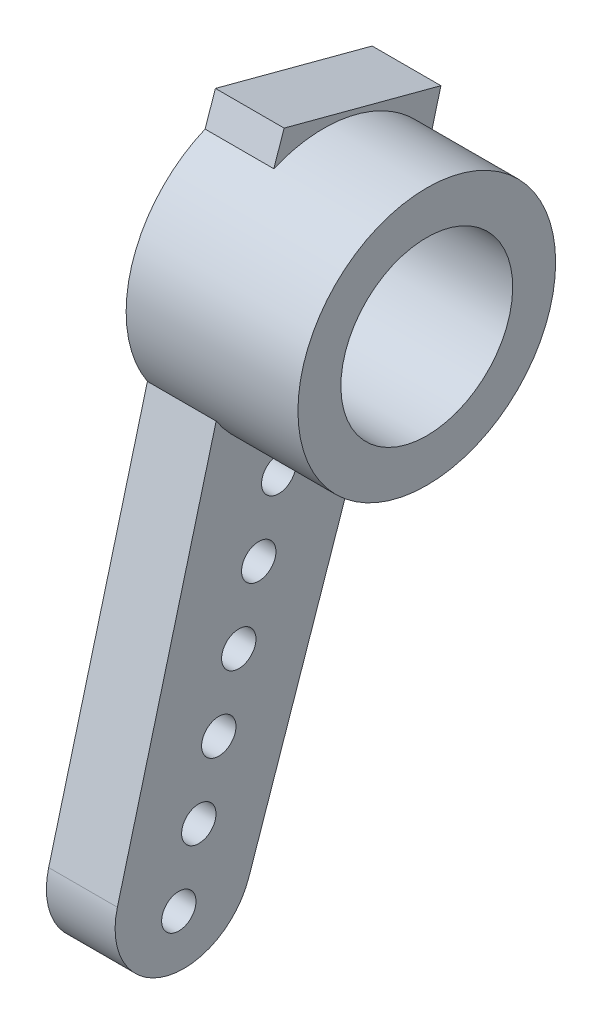
ISO-10303-21;
HEADER;
FILE_DESCRIPTION(('STEP AP214'),'2;1');
FILE_NAME('part.step','',(''),(''),'','','');
FILE_SCHEMA(('AUTOMOTIVE_DESIGN { 1 0 10303 214 1 1 1 1 }'));
ENDSEC;
DATA;
#1=APPLICATION_CONTEXT('core data for automotive mechanical design processes');
#2=APPLICATION_PROTOCOL_DEFINITION('international standard','automotive_design',2000,#1);
#3=PRODUCT_CONTEXT('',#1,'mechanical');
#4=PRODUCT('Part','Part','',(#3));
#5=PRODUCT_RELATED_PRODUCT_CATEGORY('part','',(#4));
#6=PRODUCT_DEFINITION_FORMATION('','',#4);
#7=PRODUCT_DEFINITION_CONTEXT('part definition',#1,'design');
#8=PRODUCT_DEFINITION('design','',#6,#7);
#9=PRODUCT_DEFINITION_SHAPE('','',#8);
#10=(LENGTH_UNIT() NAMED_UNIT(*) SI_UNIT(.MILLI.,.METRE.));
#11=(NAMED_UNIT(*) PLANE_ANGLE_UNIT() SI_UNIT($,.RADIAN.));
#12=(NAMED_UNIT(*) SI_UNIT($,.STERADIAN.) SOLID_ANGLE_UNIT());
#13=UNCERTAINTY_MEASURE_WITH_UNIT(LENGTH_MEASURE(1.E-05),#10,'distance_accuracy_value','');
#14=(GEOMETRIC_REPRESENTATION_CONTEXT(3) GLOBAL_UNCERTAINTY_ASSIGNED_CONTEXT((#13)) GLOBAL_UNIT_ASSIGNED_CONTEXT((#10,
#11,#12)) REPRESENTATION_CONTEXT('',''));
#15=CARTESIAN_POINT('',(0.,0.,0.));
#16=DIRECTION('',(0.,0.,1.));
#17=DIRECTION('',(1.,0.,0.));
#18=AXIS2_PLACEMENT_3D('',#15,#16,#17);
#19=CARTESIAN_POINT('',(-60.5321683868863,-3.89878457457896,-40.742461802461));
#20=DIRECTION('',(0.,-0.966465592869307,0.25679614054689));
#21=DIRECTION('',(0.,-0.25679614054689,-0.966465592869308));
#22=AXIS2_PLACEMENT_3D('',#19,#20,#21);
#23=PLANE('',#22);
#24=DIRECTION('',(0.,-0.25679614054689,-0.966465592869308));
#25=VECTOR('',#24,1.);
#26=CARTESIAN_POINT('',(-63.5421683868863,-3.25787408113389,-38.3303619215812));
#27=LINE('',#26,#25);
#28=CARTESIAN_POINT('',(-63.5421683868863,-2.68625102175923,-36.1790288921994));
#29=VERTEX_POINT('',#28);
#30=CARTESIAN_POINT('',(-63.5421683868863,-3.89878457457897,-40.7424618024611));
#31=VERTEX_POINT('',#30);
#32=EDGE_CURVE('E48',#29,#31,#27,.T.);
#33=ORIENTED_EDGE('',*,*,#32,.T.);
#34=DIRECTION('',(-1.,0.,0.));
#35=VECTOR('',#34,1.);
#36=CARTESIAN_POINT('',(-63.5421683868863,-3.89878457457898,-40.7424618024611));
#37=LINE('',#36,#35);
#38=CARTESIAN_POINT('',(-65.5421683868863,-3.89878457457897,-40.742461802461));
#39=VERTEX_POINT('',#38);
#40=EDGE_CURVE('E11',#31,#39,#37,.T.);
#41=ORIENTED_EDGE('',*,*,#40,.T.);
#42=DIRECTION('',(0.,-0.25679614054689,-0.966465592869308));
#43=VECTOR('',#42,1.);
#44=CARTESIAN_POINT('',(-65.5421683868863,-3.25787408113389,-38.3303619215812));
#45=LINE('',#44,#43);
#46=CARTESIAN_POINT('',(-65.5421683868863,-2.68625102175923,-36.1790288921994));
#47=VERTEX_POINT('',#46);
#48=EDGE_CURVE('E174',#47,#39,#45,.T.);
#49=ORIENTED_EDGE('',*,*,#48,.F.);
#50=DIRECTION('',(-1.,0.,0.));
#51=VECTOR('',#50,1.);
#52=CARTESIAN_POINT('',(-63.5421683868863,-2.68625102175924,-36.1790288921994));
#53=LINE('',#52,#51);
#54=EDGE_CURVE('E65',#29,#47,#53,.T.);
#55=ORIENTED_EDGE('',*,*,#54,.F.);
#56=EDGE_LOOP('',(#33,#41,#49,#55));
#57=FACE_BOUND('',#56,.T.);
#58=ADVANCED_FACE('F45',(#57),#23,.F.);
#59=CARTESIAN_POINT('',(-64.5421683868863,-7.01811978669977,-37.3312403886246));
#60=DIRECTION('',(-1.,0.,0.));
#61=DIRECTION('',(0.,0.956765200353524,-0.29086139550047));
#62=AXIS2_PLACEMENT_3D('',#59,#60,#61);
#63=PLANE('',#62);
#64=CARTESIAN_POINT('',(-64.5421683868863,-7.01811978669977,-37.3312403886246));
#65=DIRECTION('',(-1.,0.,0.));
#66=DIRECTION('',(0.,-0.956765200353524,0.29086139550047));
#67=AXIS2_PLACEMENT_3D('',#64,#65,#66);
#68=CIRCLE('',#67,1.25);
#69=CARTESIAN_POINT('',(-64.5421683868863,-8.21407628714167,-36.9676636442491));
#70=VERTEX_POINT('',#69);
#71=EDGE_CURVE('E302',#70,#70,#68,.T.);
#72=ORIENTED_EDGE('',*,*,#71,.T.);
#73=EDGE_LOOP('',(#72));
#74=FACE_BOUND('',#73,.T.);
#75=CARTESIAN_POINT('',(-64.5421683868863,-7.01811978669977,-37.3312403886246));
#76=DIRECTION('',(-1.,0.,0.));
#77=DIRECTION('',(0.,-0.956765200353524,0.29086139550047));
#78=AXIS2_PLACEMENT_3D('',#75,#76,#77);
#79=CIRCLE('',#78,2.5);
#80=CARTESIAN_POINT('',(-64.5421683868863,-9.41003278758358,-36.6040868998735));
#81=VERTEX_POINT('',#80);
#82=EDGE_CURVE('E294',#81,#81,#79,.T.);
#83=ORIENTED_EDGE('',*,*,#82,.F.);
#84=EDGE_LOOP('',(#83));
#85=FACE_BOUND('',#84,.T.);
#86=ADVANCED_FACE('F339',(#74,#85),#63,.F.);
#87=CARTESIAN_POINT('',(-65.5421683868863,-7.01811978669977,-37.3312403886246));
#88=DIRECTION('',(1.,0.,0.));
#89=DIRECTION('',(0.,0.956765200353524,-0.29086139550047));
#90=AXIS2_PLACEMENT_3D('',#87,#88,#89);
#91=CYLINDRICAL_SURFACE('',#90,2.5);
#92=CARTESIAN_POINT('',(-60.5421683868863,-7.01811978669977,-37.3312403886246));
#93=DIRECTION('',(1.,0.,0.));
#94=DIRECTION('',(0.,0.956765200353524,-0.29086139550047));
#95=AXIS2_PLACEMENT_3D('',#92,#93,#94);
#96=CIRCLE('',#95,2.5);
#97=CARTESIAN_POINT('',(-60.5421683868863,-4.62620678581596,-38.0583938773758));
#98=VERTEX_POINT('',#97);
#99=EDGE_CURVE('E261',#98,#98,#96,.T.);
#100=ORIENTED_EDGE('',*,*,#99,.T.);
#101=EDGE_LOOP('',(#100));
#102=FACE_BOUND('',#101,.T.);
#103=ORIENTED_EDGE('',*,*,#82,.T.);
#104=EDGE_LOOP('',(#103));
#105=FACE_BOUND('',#104,.T.);
#106=ADVANCED_FACE('F326',(#102,#105),#91,.F.);
#107=CARTESIAN_POINT('',(-60.0421683868863,-7.01811978669977,-37.3312403886246));
#108=DIRECTION('',(-1.,0.,0.));
#109=DIRECTION('',(0.,-0.956765200353524,0.29086139550047));
#110=AXIS2_PLACEMENT_3D('',#107,#108,#109);
#111=CYLINDRICAL_SURFACE('',#110,1.25);
#112=CARTESIAN_POINT('',(-65.0421683868863,-7.01811978669977,-37.3312403886246));
#113=DIRECTION('',(-1.,0.,0.));
#114=DIRECTION('',(0.,-0.956765200353524,0.29086139550047));
#115=AXIS2_PLACEMENT_3D('',#112,#113,#114);
#116=CIRCLE('',#115,1.25);
#117=CARTESIAN_POINT('',(-65.0421683868863,-8.21407628714167,-36.9676636442491));
#118=VERTEX_POINT('',#117);
#119=EDGE_CURVE('E170',#118,#118,#116,.T.);
#120=ORIENTED_EDGE('',*,*,#119,.T.);
#121=EDGE_LOOP('',(#120));
#122=FACE_BOUND('',#121,.T.);
#123=ORIENTED_EDGE('',*,*,#71,.F.);
#124=EDGE_LOOP('',(#123));
#125=FACE_BOUND('',#124,.T.);
#126=ADVANCED_FACE('F309',(#122,#125),#111,.F.);
#127=CARTESIAN_POINT('',(-63.5421683868863,-13.2370935889977,-35.4406413178716));
#128=DIRECTION('',(-1.,0.,0.));
#129=DIRECTION('',(0.,-0.956765200353524,0.29086139550047));
#130=AXIS2_PLACEMENT_3D('',#127,#128,#129);
#131=CYLINDRICAL_SURFACE('',#130,0.5);
#132=CARTESIAN_POINT('',(-64.5421683868863,-13.2370935889977,-35.4406413178715));
#133=DIRECTION('',(-1.,0.,0.));
#134=DIRECTION('',(0.,-0.956765200353524,0.29086139550047));
#135=AXIS2_PLACEMENT_3D('',#132,#133,#134);
#136=CIRCLE('',#135,0.5);
#137=CARTESIAN_POINT('',(-64.5421683868863,-13.7154761891744,-35.2952106201213));
#138=VERTEX_POINT('',#137);
#139=EDGE_CURVE('E273',#138,#138,#136,.T.);
#140=ORIENTED_EDGE('',*,*,#139,.T.);
#141=EDGE_LOOP('',(#140));
#142=FACE_BOUND('',#141,.T.);
#143=CARTESIAN_POINT('',(-63.5421683868863,-13.2370935889977,-35.4406413178716));
#144=DIRECTION('',(-1.,0.,0.));
#145=DIRECTION('',(0.,-0.956765200353524,0.29086139550047));
#146=AXIS2_PLACEMENT_3D('',#143,#144,#145);
#147=CIRCLE('',#146,0.5);
#148=CARTESIAN_POINT('',(-63.5421683868863,-13.7154761891744,-35.2952106201214));
#149=VERTEX_POINT('',#148);
#150=EDGE_CURVE('E270',#149,#149,#147,.T.);
#151=ORIENTED_EDGE('',*,*,#150,.F.);
#152=EDGE_LOOP('',(#151));
#153=FACE_BOUND('',#152,.T.);
#154=ADVANCED_FACE('F385',(#142,#153),#131,.F.);
#155=CARTESIAN_POINT('',(-60.5421683868863,-7.01811978669977,-37.3312403886246));
#156=DIRECTION('',(1.,0.,0.));
#157=DIRECTION('',(0.,0.956765200353524,-0.29086139550047));
#158=AXIS2_PLACEMENT_3D('',#155,#156,#157);
#159=PLANE('',#158);
#160=ORIENTED_EDGE('',*,*,#99,.F.);
#161=EDGE_LOOP('',(#160));
#162=FACE_BOUND('',#161,.T.);
#163=CARTESIAN_POINT('',(-60.5421683868863,-7.01811978669977,-37.3312403886246));
#164=DIRECTION('',(1.,0.,0.));
#165=DIRECTION('',(0.,0.956765200353524,-0.29086139550047));
#166=AXIS2_PLACEMENT_3D('',#163,#164,#165);
#167=CIRCLE('',#166,3.75);
#168=CARTESIAN_POINT('',(-60.5421683868863,-3.43025028537405,-38.4219706217514));
#169=VERTEX_POINT('',#168);
#170=EDGE_CURVE('E256',#169,#169,#167,.T.);
#171=ORIENTED_EDGE('',*,*,#170,.T.);
#172=EDGE_LOOP('',(#171));
#173=FACE_BOUND('',#172,.T.);
#174=ADVANCED_FACE('F316',(#162,#173),#159,.T.);
#175=CARTESIAN_POINT('',(-65.0421683868863,-7.01811978669977,-37.3312403886246));
#176=DIRECTION('',(-1.,0.,0.));
#177=DIRECTION('',(0.,-0.956765200353524,0.29086139550047));
#178=AXIS2_PLACEMENT_3D('',#175,#176,#177);
#179=PLANE('',#178);
#180=ORIENTED_EDGE('',*,*,#119,.F.);
#181=EDGE_LOOP('',(#180));
#182=FACE_BOUND('',#181,.T.);
#183=CARTESIAN_POINT('',(-65.0421683868863,-7.01811978669977,-37.3312403886246));
#184=DIRECTION('',(-1.,0.,0.));
#185=DIRECTION('',(0.,-0.956765200353524,0.29086139550047));
#186=AXIS2_PLACEMENT_3D('',#183,#184,#185);
#187=CIRCLE('',#186,2.5);
#188=CARTESIAN_POINT('',(-65.0421683868863,-9.41003278758358,-36.6040868998735));
#189=VERTEX_POINT('',#188);
#190=EDGE_CURVE('E300',#189,#189,#187,.T.);
#191=ORIENTED_EDGE('',*,*,#190,.T.);
#192=EDGE_LOOP('',(#191));
#193=FACE_BOUND('',#192,.T.);
#194=ADVANCED_FACE('F312',(#182,#193),#179,.T.);
#195=CARTESIAN_POINT('',(-63.5421683868863,-7.01811978669977,-37.3312403886246));
#196=DIRECTION('',(1.,0.,0.));
#197=DIRECTION('',(0.,0.956765200353524,-0.29086139550047));
#198=AXIS2_PLACEMENT_3D('',#195,#196,#197);
#199=PLANE('',#198);
#200=CARTESIAN_POINT('',(-63.5421683868863,-11.3235631882906,-36.0223641088725));
#201=DIRECTION('',(-1.,0.,0.));
#202=DIRECTION('',(0.,-0.956765200353524,0.29086139550047));
#203=AXIS2_PLACEMENT_3D('',#200,#201,#202);
#204=CIRCLE('',#203,0.5);
#205=CARTESIAN_POINT('',(-63.5421683868863,-11.8019457884674,-35.8769334111223));
#206=VERTEX_POINT('',#205);
#207=EDGE_CURVE('E264',#206,#206,#204,.T.);
#208=ORIENTED_EDGE('',*,*,#207,.T.);
#209=EDGE_LOOP('',(#208));
#210=FACE_BOUND('',#209,.T.);
#211=CARTESIAN_POINT('',(-63.5421683868863,-15.1506239897047,-34.8589185268706));
#212=DIRECTION('',(-1.,0.,0.));
#213=DIRECTION('',(0.,-0.956765200353524,0.29086139550047));
#214=AXIS2_PLACEMENT_3D('',#211,#212,#213);
#215=CIRCLE('',#214,0.5);
#216=CARTESIAN_POINT('',(-63.5421683868863,-15.6290065898815,-34.7134878291204));
#217=VERTEX_POINT('',#216);
#218=EDGE_CURVE('E156',#217,#217,#215,.T.);
#219=ORIENTED_EDGE('',*,*,#218,.T.);
#220=EDGE_LOOP('',(#219));
#221=FACE_BOUND('',#220,.T.);
#222=CARTESIAN_POINT('',(-63.5421683868863,-18.9776847911188,-33.6954729448687));
#223=DIRECTION('',(-1.,0.,0.));
#224=DIRECTION('',(0.,-0.956765200353524,0.29086139550047));
#225=AXIS2_PLACEMENT_3D('',#222,#223,#224);
#226=CIRCLE('',#225,0.5);
#227=CARTESIAN_POINT('',(-63.5421683868863,-19.4560673912956,-33.5500422471185));
#228=VERTEX_POINT('',#227);
#229=EDGE_CURVE('E282',#228,#228,#226,.T.);
#230=ORIENTED_EDGE('',*,*,#229,.T.);
#231=EDGE_LOOP('',(#230));
#232=FACE_BOUND('',#231,.T.);
#233=CARTESIAN_POINT('',(-63.5421683868863,-20.8912151918259,-33.1137501538678));
#234=DIRECTION('',(-1.,0.,0.));
#235=DIRECTION('',(0.,-0.956765200353524,0.29086139550047));
#236=AXIS2_PLACEMENT_3D('',#233,#234,#235);
#237=CIRCLE('',#236,0.5);
#238=CARTESIAN_POINT('',(-63.5421683868863,-21.3695977920026,-32.9683194561176));
#239=VERTEX_POINT('',#238);
#240=EDGE_CURVE('E288',#239,#239,#237,.T.);
#241=ORIENTED_EDGE('',*,*,#240,.T.);
#242=EDGE_LOOP('',(#241));
#243=FACE_BOUND('',#242,.T.);
#244=CARTESIAN_POINT('',(-63.5421683868863,-17.0641543904118,-34.2771957358697));
#245=DIRECTION('',(-1.,0.,0.));
#246=DIRECTION('',(0.,-0.956765200353524,0.29086139550047));
#247=AXIS2_PLACEMENT_3D('',#244,#245,#246);
#248=CIRCLE('',#247,0.5);
#249=CARTESIAN_POINT('',(-63.5421683868863,-17.5425369905885,-34.1317650381195));
#250=VERTEX_POINT('',#249);
#251=EDGE_CURVE('E276',#250,#250,#248,.T.);
#252=ORIENTED_EDGE('',*,*,#251,.T.);
#253=EDGE_LOOP('',(#252));
#254=FACE_BOUND('',#253,.T.);
#255=ORIENTED_EDGE('',*,*,#150,.T.);
#256=EDGE_LOOP('',(#255));
#257=FACE_BOUND('',#256,.T.);
#258=CARTESIAN_POINT('',(-63.5421683868863,-7.01811978669977,-37.3312403886246));
#259=DIRECTION('',(1.,0.,0.));
#260=DIRECTION('',(0.,0.956765200353524,-0.29086139550047));
#261=AXIS2_PLACEMENT_3D('',#258,#259,#260);
#262=CIRCLE('',#261,3.75);
#263=CARTESIAN_POINT('',(-63.5421683868863,-9.08219229492958,-34.2004090803664));
#264=VERTEX_POINT('',#263);
#265=CARTESIAN_POINT('',(-63.5421683868863,-10.4754832029352,-38.7835276219489));
#266=VERTEX_POINT('',#265);
#267=EDGE_CURVE('E205',#264,#266,#262,.T.);
#268=ORIENTED_EDGE('',*,*,#267,.F.);
#269=DIRECTION('',(0.,0.966465592869309,-0.256796140546886));
#270=VECTOR('',#269,1.);
#271=CARTESIAN_POINT('',(-63.5421683868863,-19.8992403105553,-31.3262496658794));
#272=LINE('',#271,#270);
#273=CARTESIAN_POINT('',(-63.5421683868863,-19.8992403105553,-31.3262496658794));
#274=VERTEX_POINT('',#273);
#275=EDGE_CURVE('E242',#274,#264,#272,.T.);
#276=ORIENTED_EDGE('',*,*,#275,.F.);
#277=CARTESIAN_POINT('',(-63.5421683868863,-20.4128325916491,-33.2591808516181));
#278=DIRECTION('',(1.,0.,0.));
#279=DIRECTION('',(0.,0.956765200353524,-0.29086139550047));
#280=AXIS2_PLACEMENT_3D('',#277,#278,#279);
#281=CIRCLE('',#280,2.);
#282=CARTESIAN_POINT('',(-63.5421683868863,-21.0619560985065,-35.1509098683763));
#283=VERTEX_POINT('',#282);
#284=EDGE_CURVE('E210',#274,#283,#281,.T.);
#285=ORIENTED_EDGE('',*,*,#284,.T.);
#286=DIRECTION('',(0.,0.945864508379121,-0.324561753428719));
#287=VECTOR('',#286,1.);
#288=CARTESIAN_POINT('',(-63.5421683868863,-21.0619560985065,-35.1509098683763));
#289=LINE('',#288,#287);
#290=EDGE_CURVE('E224',#283,#266,#289,.T.);
#291=ORIENTED_EDGE('',*,*,#290,.T.);
#292=EDGE_LOOP('',(#268,#276,#285,#291));
#293=FACE_BOUND('',#292,.T.);
#294=ADVANCED_FACE('F315',(#210,#221,#232,#243,#254,#257,#293),#199,.T.);
#295=ORIENTED_EDGE('',*,*,#139,.F.);
#296=EDGE_LOOP('',(#295));
#297=FACE_BOUND('',#296,.T.);
#298=CARTESIAN_POINT('',(-64.5421683868863,-15.1506239897047,-34.8589185268706));
#299=DIRECTION('',(-1.,0.,0.));
#300=DIRECTION('',(0.,-0.956765200353524,0.29086139550047));
#301=AXIS2_PLACEMENT_3D('',#298,#299,#300);
#302=CIRCLE('',#301,0.5);
#303=CARTESIAN_POINT('',(-64.5421683868863,-15.1311898867169,-34.3592963539829));
#304=VERTEX_POINT('',#303);
#305=CARTESIAN_POINT('',(-64.5421683868863,-15.4125539239037,-35.2848207569311));
#306=VERTEX_POINT('',#305);
#307=EDGE_CURVE('E126',#304,#306,#302,.T.);
#308=ORIENTED_EDGE('',*,*,#307,.F.);
#309=CARTESIAN_POINT('',(-64.5421683868863,-13.7154761891744,-35.2952106201213));
#310=DIRECTION('',(1.,0.,0.));
#311=DIRECTION('',(0.,0.956765200353524,-0.29086139550047));
#312=AXIS2_PLACEMENT_3D('',#309,#310,#311);
#313=CIRCLE('',#312,1.69710953888392);
#314=EDGE_CURVE('E133',#306,#304,#313,.T.);
#315=ORIENTED_EDGE('',*,*,#314,.F.);
#316=EDGE_LOOP('',(#308,#315));
#317=FACE_BOUND('',#316,.T.);
#318=ADVANCED_FACE('F136',(#297,#317),#63,.T.);
#319=ORIENTED_EDGE('',*,*,#32,.F.);
#320=DIRECTION('',(0.,-0.945864508379121,0.324561753428719));
#321=VECTOR('',#320,1.);
#322=CARTESIAN_POINT('',(-63.5421683868863,7.025716525107,-39.5115709088729));
#323=LINE('',#322,#321);
#324=CARTESIAN_POINT('',(-63.5421683868863,-3.56075637046432,-35.8789531553003));
#325=VERTEX_POINT('',#324);
#326=EDGE_CURVE('E173',#29,#325,#323,.T.);
#327=ORIENTED_EDGE('',*,*,#326,.T.);
#328=CARTESIAN_POINT('',(-63.5421683868863,-7.01811978669977,-37.3312403886246));
#329=DIRECTION('',(1.,0.,0.));
#330=DIRECTION('',(0.,0.956765200353524,-0.29086139550047));
#331=AXIS2_PLACEMENT_3D('',#328,#329,#330);
#332=CIRCLE('',#331,3.75);
#333=CARTESIAN_POINT('',(-63.5421683868863,-4.95404727846997,-40.4620716968828));
#334=VERTEX_POINT('',#333);
#335=EDGE_CURVE('E190',#334,#325,#332,.T.);
#336=ORIENTED_EDGE('',*,*,#335,.F.);
#337=DIRECTION('',(0.,-0.966465592869309,0.256796140546886));
#338=VECTOR('',#337,1.);
#339=CARTESIAN_POINT('',(-63.5421683868863,5.86300073715578,-43.3362311113698));
#340=LINE('',#339,#338);
#341=EDGE_CURVE('E176',#31,#334,#340,.T.);
#342=ORIENTED_EDGE('',*,*,#341,.F.);
#343=EDGE_LOOP('',(#319,#327,#336,#342));
#344=FACE_BOUND('',#343,.T.);
#345=ADVANCED_FACE('F367',(#344),#199,.T.);
#346=CARTESIAN_POINT('',(-63.5421683868863,-6.3772092932547,-34.9191405077448));
#347=DIRECTION('',(0.,0.256796140546886,0.966465592869309));
#348=DIRECTION('',(1.,0.,0.));
#349=AXIS2_PLACEMENT_3D('',#346,#347,#348);
#350=PLANE('',#349);
#351=DIRECTION('',(0.,0.966465592869309,-0.256796140546886));
#352=VECTOR('',#351,1.);
#353=CARTESIAN_POINT('',(-65.5421683868863,-19.8992403105553,-31.3262496658794));
#354=LINE('',#353,#352);
#355=CARTESIAN_POINT('',(-65.5421683868863,-19.8992403105553,-31.3262496658794));
#356=VERTEX_POINT('',#355);
#357=CARTESIAN_POINT('',(-65.5421683868863,-9.08219229492958,-34.2004090803664));
#358=VERTEX_POINT('',#357);
#359=EDGE_CURVE('E251',#356,#358,#354,.T.);
#360=ORIENTED_EDGE('',*,*,#359,.F.);
#361=DIRECTION('',(-1.,0.,0.));
#362=VECTOR('',#361,1.);
#363=CARTESIAN_POINT('',(-63.5421683868863,-19.8992403105553,-31.3262496658794));
#364=LINE('',#363,#362);
#365=EDGE_CURVE('E246',#274,#356,#364,.T.);
#366=ORIENTED_EDGE('',*,*,#365,.F.);
#367=ORIENTED_EDGE('',*,*,#275,.T.);
#368=DIRECTION('',(-1.,0.,0.));
#369=VECTOR('',#368,1.);
#370=CARTESIAN_POINT('',(-63.5421683868863,-9.08219229492958,-34.2004090803664));
#371=LINE('',#370,#369);
#372=EDGE_CURVE('E238',#264,#358,#371,.T.);
#373=ORIENTED_EDGE('',*,*,#372,.T.);
#374=EDGE_LOOP('',(#360,#366,#367,#373));
#375=FACE_BOUND('',#374,.T.);
#376=ADVANCED_FACE('F375',(#375),#350,.T.);
#377=CARTESIAN_POINT('',(-63.5421683868863,-20.4128325916491,-33.2591808516181));
#378=DIRECTION('',(-1.,0.,0.));
#379=DIRECTION('',(0.,-0.956765200353524,0.29086139550047));
#380=AXIS2_PLACEMENT_3D('',#377,#378,#379);
#381=CYLINDRICAL_SURFACE('',#380,2.);
#382=CARTESIAN_POINT('',(-65.5421683868863,-20.4128325916491,-33.2591808516181));
#383=DIRECTION('',(1.,0.,0.));
#384=DIRECTION('',(0.,0.956765200353524,-0.29086139550047));
#385=AXIS2_PLACEMENT_3D('',#382,#383,#384);
#386=CIRCLE('',#385,2.);
#387=CARTESIAN_POINT('',(-65.5421683868863,-21.0619560985065,-35.1509098683763));
#388=VERTEX_POINT('',#387);
#389=EDGE_CURVE('E215',#356,#388,#386,.T.);
#390=ORIENTED_EDGE('',*,*,#389,.T.);
#391=DIRECTION('',(-1.,0.,0.));
#392=VECTOR('',#391,1.);
#393=CARTESIAN_POINT('',(-63.5421683868863,-21.0619560985065,-35.1509098683763));
#394=LINE('',#393,#392);
#395=EDGE_CURVE('E220',#283,#388,#394,.T.);
#396=ORIENTED_EDGE('',*,*,#395,.F.);
#397=ORIENTED_EDGE('',*,*,#284,.F.);
#398=ORIENTED_EDGE('',*,*,#365,.T.);
#399=EDGE_LOOP('',(#390,#396,#397,#398));
#400=FACE_BOUND('',#399,.T.);
#401=ADVANCED_FACE('F372',(#400),#381,.T.);
#402=CARTESIAN_POINT('',(-63.5421683868863,-7.82815934999071,-39.6919241882581));
#403=DIRECTION('',(0.,0.32456175342872,0.945864508379121));
#404=DIRECTION('',(1.,0.,0.));
#405=AXIS2_PLACEMENT_3D('',#402,#403,#404);
#406=PLANE('',#405);
#407=DIRECTION('',(0.,0.945864508379121,-0.324561753428719));
#408=VECTOR('',#407,1.);
#409=CARTESIAN_POINT('',(-65.5421683868863,-21.0619560985065,-35.1509098683763));
#410=LINE('',#409,#408);
#411=CARTESIAN_POINT('',(-65.5421683868863,-10.4754832029352,-38.7835276219489));
#412=VERTEX_POINT('',#411);
#413=EDGE_CURVE('E234',#388,#412,#410,.T.);
#414=ORIENTED_EDGE('',*,*,#413,.T.);
#415=DIRECTION('',(-1.,0.,0.));
#416=VECTOR('',#415,1.);
#417=CARTESIAN_POINT('',(-63.5421683868863,-10.4754832029352,-38.7835276219489));
#418=LINE('',#417,#416);
#419=EDGE_CURVE('E229',#266,#412,#418,.T.);
#420=ORIENTED_EDGE('',*,*,#419,.F.);
#421=ORIENTED_EDGE('',*,*,#290,.F.);
#422=ORIENTED_EDGE('',*,*,#395,.T.);
#423=EDGE_LOOP('',(#414,#420,#421,#422));
#424=FACE_BOUND('',#423,.T.);
#425=ADVANCED_FACE('F370',(#424),#406,.F.);
#426=CARTESIAN_POINT('',(-65.5421683868863,-7.01811978669977,-37.3312403886246));
#427=DIRECTION('',(1.,0.,0.));
#428=DIRECTION('',(0.,0.956765200353524,-0.29086139550047));
#429=AXIS2_PLACEMENT_3D('',#426,#427,#428);
#430=CYLINDRICAL_SURFACE('',#429,3.75);
#431=ORIENTED_EDGE('',*,*,#267,.T.);
#432=ORIENTED_EDGE('',*,*,#419,.T.);
#433=CARTESIAN_POINT('',(-65.5421683868863,-7.01811978669977,-37.3312403886246));
#434=DIRECTION('',(-1.,0.,0.));
#435=DIRECTION('',(0.,-0.956765200353524,0.29086139550047));
#436=AXIS2_PLACEMENT_3D('',#433,#434,#435);
#437=CIRCLE('',#436,3.75);
#438=CARTESIAN_POINT('',(-65.5421683868863,-4.95404727846997,-40.4620716968828));
#439=VERTEX_POINT('',#438);
#440=EDGE_CURVE('E200',#439,#412,#437,.T.);
#441=ORIENTED_EDGE('',*,*,#440,.F.);
#442=DIRECTION('',(-1.,0.,0.));
#443=VECTOR('',#442,1.);
#444=CARTESIAN_POINT('',(-63.5421683868863,-4.95404727846997,-40.4620716968828));
#445=LINE('',#444,#443);
#446=EDGE_CURVE('E195',#334,#439,#445,.T.);
#447=ORIENTED_EDGE('',*,*,#446,.F.);
#448=ORIENTED_EDGE('',*,*,#335,.T.);
#449=DIRECTION('',(-1.,0.,0.));
#450=VECTOR('',#449,1.);
#451=CARTESIAN_POINT('',(-63.5421683868863,-3.56075637046432,-35.8789531553003));
#452=LINE('',#451,#450);
#453=CARTESIAN_POINT('',(-65.5421683868863,-3.56075637046432,-35.8789531553003));
#454=VERTEX_POINT('',#453);
#455=EDGE_CURVE('E185',#325,#454,#452,.T.);
#456=ORIENTED_EDGE('',*,*,#455,.T.);
#457=CARTESIAN_POINT('',(-65.5421683868863,-7.01811978669977,-37.3312403886246));
#458=DIRECTION('',(-1.,0.,0.));
#459=DIRECTION('',(0.,-0.956765200353524,0.29086139550047));
#460=AXIS2_PLACEMENT_3D('',#457,#458,#459);
#461=CIRCLE('',#460,3.75);
#462=EDGE_CURVE('E178',#358,#454,#461,.T.);
#463=ORIENTED_EDGE('',*,*,#462,.F.);
#464=ORIENTED_EDGE('',*,*,#372,.F.);
#465=EDGE_LOOP('',(#431,#432,#441,#447,#448,#456,#463,#464));
#466=FACE_BOUND('',#465,.T.);
#467=ORIENTED_EDGE('',*,*,#170,.F.);
#468=EDGE_LOOP('',(#467));
#469=FACE_BOUND('',#468,.T.);
#470=ADVANCED_FACE('F360',(#466,#469),#430,.T.);
#471=CARTESIAN_POINT('',(-63.5421683868863,-7.65903028014484,-39.7433402695045));
#472=DIRECTION('',(0.,-0.256796140546886,-0.966465592869309));
#473=DIRECTION('',(-1.,0.,0.));
#474=AXIS2_PLACEMENT_3D('',#471,#472,#473);
#475=PLANE('',#474);
#476=ORIENTED_EDGE('',*,*,#40,.F.);
#477=ORIENTED_EDGE('',*,*,#341,.T.);
#478=ORIENTED_EDGE('',*,*,#446,.T.);
#479=DIRECTION('',(0.,-0.966465592869309,0.256796140546886));
#480=VECTOR('',#479,1.);
#481=CARTESIAN_POINT('',(-65.5421683868863,5.86300073715578,-43.3362311113698));
#482=LINE('',#481,#480);
#483=EDGE_CURVE('E161',#39,#439,#482,.T.);
#484=ORIENTED_EDGE('',*,*,#483,.F.);
#485=EDGE_LOOP('',(#476,#477,#478,#484));
#486=FACE_BOUND('',#485,.T.);
#487=ADVANCED_FACE('F356',(#486),#475,.T.);
#488=CARTESIAN_POINT('',(-63.5421683868863,-6.20808022340883,-34.9705565889911));
#489=DIRECTION('',(0.,-0.324561753428719,-0.945864508379121));
#490=DIRECTION('',(-1.,0.,0.));
#491=AXIS2_PLACEMENT_3D('',#488,#489,#490);
#492=PLANE('',#491);
#493=ORIENTED_EDGE('',*,*,#326,.F.);
#494=ORIENTED_EDGE('',*,*,#54,.T.);
#495=DIRECTION('',(0.,-0.945864508379121,0.324561753428719));
#496=VECTOR('',#495,1.);
#497=CARTESIAN_POINT('',(-65.5421683868863,7.025716525107,-39.5115709088729));
#498=LINE('',#497,#496);
#499=EDGE_CURVE('E169',#47,#454,#498,.T.);
#500=ORIENTED_EDGE('',*,*,#499,.T.);
#501=ORIENTED_EDGE('',*,*,#455,.F.);
#502=EDGE_LOOP('',(#493,#494,#500,#501));
#503=FACE_BOUND('',#502,.T.);
#504=ADVANCED_FACE('F359',(#503),#492,.F.);
#505=CARTESIAN_POINT('',(-63.5421683868863,-11.3235631882906,-36.0223641088725));
#506=DIRECTION('',(-1.,0.,0.));
#507=DIRECTION('',(0.,-0.956765200353524,0.29086139550047));
#508=AXIS2_PLACEMENT_3D('',#505,#506,#507);
#509=CYLINDRICAL_SURFACE('',#508,0.5);
#510=CARTESIAN_POINT('',(-65.5421683868863,-11.3235631882906,-36.0223641088725));
#511=DIRECTION('',(-1.,0.,0.));
#512=DIRECTION('',(0.,-0.956765200353524,0.29086139550047));
#513=AXIS2_PLACEMENT_3D('',#510,#511,#512);
#514=CIRCLE('',#513,0.5);
#515=CARTESIAN_POINT('',(-65.5421683868863,-11.8019457884674,-35.8769334111223));
#516=VERTEX_POINT('',#515);
#517=EDGE_CURVE('E267',#516,#516,#514,.T.);
#518=ORIENTED_EDGE('',*,*,#517,.T.);
#519=EDGE_LOOP('',(#518));
#520=FACE_BOUND('',#519,.T.);
#521=ORIENTED_EDGE('',*,*,#207,.F.);
#522=EDGE_LOOP('',(#521));
#523=FACE_BOUND('',#522,.T.);
#524=ADVANCED_FACE('F334',(#520,#523),#509,.F.);
#525=CARTESIAN_POINT('',(-63.5421683868863,-18.9776847911188,-33.6954729448687));
#526=DIRECTION('',(-1.,0.,0.));
#527=DIRECTION('',(0.,-0.956765200353524,0.29086139550047));
#528=AXIS2_PLACEMENT_3D('',#525,#526,#527);
#529=CYLINDRICAL_SURFACE('',#528,0.5);
#530=CARTESIAN_POINT('',(-65.5421683868863,-18.9776847911188,-33.6954729448687));
#531=DIRECTION('',(-1.,0.,0.));
#532=DIRECTION('',(0.,-0.956765200353524,0.29086139550047));
#533=AXIS2_PLACEMENT_3D('',#530,#531,#532);
#534=CIRCLE('',#533,0.5);
#535=CARTESIAN_POINT('',(-65.5421683868863,-19.4560673912956,-33.5500422471185));
#536=VERTEX_POINT('',#535);
#537=EDGE_CURVE('E285',#536,#536,#534,.T.);
#538=ORIENTED_EDGE('',*,*,#537,.T.);
#539=EDGE_LOOP('',(#538));
#540=FACE_BOUND('',#539,.T.);
#541=ORIENTED_EDGE('',*,*,#229,.F.);
#542=EDGE_LOOP('',(#541));
#543=FACE_BOUND('',#542,.T.);
#544=ADVANCED_FACE('F323',(#540,#543),#529,.F.);
#545=CARTESIAN_POINT('',(-65.5421683868863,-7.01811978669977,-37.3312403886246));
#546=DIRECTION('',(-1.,0.,0.));
#547=DIRECTION('',(0.,0.956765200353524,-0.29086139550047));
#548=AXIS2_PLACEMENT_3D('',#545,#546,#547);
#549=CIRCLE('',#548,2.5);
#550=CARTESIAN_POINT('',(-65.5421683868863,-4.62620678581596,-38.0583938773758));
#551=VERTEX_POINT('',#550);
#552=EDGE_CURVE('E297',#551,#551,#549,.T.);
#553=ORIENTED_EDGE('',*,*,#552,.T.);
#554=EDGE_LOOP('',(#553));
#555=FACE_BOUND('',#554,.T.);
#556=ORIENTED_EDGE('',*,*,#190,.F.);
#557=EDGE_LOOP('',(#556));
#558=FACE_BOUND('',#557,.T.);
#559=ADVANCED_FACE('F320',(#555,#558),#91,.F.);
#560=CARTESIAN_POINT('',(-63.5421683868863,-20.8912151918259,-33.1137501538678));
#561=DIRECTION('',(-1.,0.,0.));
#562=DIRECTION('',(0.,-0.956765200353524,0.29086139550047));
#563=AXIS2_PLACEMENT_3D('',#560,#561,#562);
#564=CYLINDRICAL_SURFACE('',#563,0.5);
#565=CARTESIAN_POINT('',(-65.5421683868863,-20.8912151918259,-33.1137501538678));
#566=DIRECTION('',(-1.,0.,0.));
#567=DIRECTION('',(0.,-0.956765200353524,0.29086139550047));
#568=AXIS2_PLACEMENT_3D('',#565,#566,#567);
#569=CIRCLE('',#568,0.5);
#570=CARTESIAN_POINT('',(-65.5421683868863,-21.3695977920026,-32.9683194561176));
#571=VERTEX_POINT('',#570);
#572=EDGE_CURVE('E291',#571,#571,#569,.T.);
#573=ORIENTED_EDGE('',*,*,#572,.T.);
#574=EDGE_LOOP('',(#573));
#575=FACE_BOUND('',#574,.T.);
#576=ORIENTED_EDGE('',*,*,#240,.F.);
#577=EDGE_LOOP('',(#576));
#578=FACE_BOUND('',#577,.T.);
#579=ADVANCED_FACE('F322',(#575,#578),#564,.F.);
#580=CARTESIAN_POINT('',(-63.5421683868863,-17.0641543904118,-34.2771957358697));
#581=DIRECTION('',(-1.,0.,0.));
#582=DIRECTION('',(0.,-0.956765200353524,0.29086139550047));
#583=AXIS2_PLACEMENT_3D('',#580,#581,#582);
#584=CYLINDRICAL_SURFACE('',#583,0.5);
#585=CARTESIAN_POINT('',(-65.5421683868863,-17.0641543904118,-34.2771957358697));
#586=DIRECTION('',(-1.,0.,0.));
#587=DIRECTION('',(0.,-0.956765200353524,0.29086139550047));
#588=AXIS2_PLACEMENT_3D('',#585,#586,#587);
#589=CIRCLE('',#588,0.5);
#590=CARTESIAN_POINT('',(-65.5421683868863,-17.5425369905885,-34.1317650381195));
#591=VERTEX_POINT('',#590);
#592=EDGE_CURVE('E279',#591,#591,#589,.T.);
#593=ORIENTED_EDGE('',*,*,#592,.T.);
#594=EDGE_LOOP('',(#593));
#595=FACE_BOUND('',#594,.T.);
#596=ORIENTED_EDGE('',*,*,#251,.F.);
#597=EDGE_LOOP('',(#596));
#598=FACE_BOUND('',#597,.T.);
#599=ADVANCED_FACE('F331',(#595,#598),#584,.F.);
#600=CARTESIAN_POINT('',(-63.5421683868863,-15.1506239897047,-34.8589185268706));
#601=DIRECTION('',(-1.,0.,0.));
#602=DIRECTION('',(0.,-0.956765200353524,0.29086139550047));
#603=AXIS2_PLACEMENT_3D('',#600,#601,#602);
#604=CYLINDRICAL_SURFACE('',#603,0.5);
#605=ORIENTED_EDGE('',*,*,#307,.T.);
#606=DIRECTION('',(-1.,0.,0.));
#607=VECTOR('',#606,1.);
#608=CARTESIAN_POINT('',(-65.5421683868863,-15.4125539239037,-35.2848207569311));
#609=LINE('',#608,#607);
#610=CARTESIAN_POINT('',(-65.5421683868863,-15.4125539239037,-35.2848207569311));
#611=VERTEX_POINT('',#610);
#612=EDGE_CURVE('E132',#306,#611,#609,.T.);
#613=ORIENTED_EDGE('',*,*,#612,.T.);
#614=CARTESIAN_POINT('',(-65.5421683868863,-15.1506239897047,-34.8589185268706));
#615=DIRECTION('',(-1.,0.,0.));
#616=DIRECTION('',(0.,-0.956765200353524,0.29086139550047));
#617=AXIS2_PLACEMENT_3D('',#614,#615,#616);
#618=CIRCLE('',#617,0.5);
#619=CARTESIAN_POINT('',(-65.5421683868863,-15.1311898867169,-34.3592963539829));
#620=VERTEX_POINT('',#619);
#621=EDGE_CURVE('E128',#611,#620,#618,.T.);
#622=ORIENTED_EDGE('',*,*,#621,.T.);
#623=DIRECTION('',(1.,0.,0.));
#624=VECTOR('',#623,1.);
#625=CARTESIAN_POINT('',(-65.5421683868863,-15.1311898867169,-34.3592963539829));
#626=LINE('',#625,#624);
#627=EDGE_CURVE('E121',#620,#304,#626,.T.);
#628=ORIENTED_EDGE('',*,*,#627,.T.);
#629=EDGE_LOOP('',(#605,#613,#622,#628));
#630=FACE_BOUND('',#629,.T.);
#631=ORIENTED_EDGE('',*,*,#218,.F.);
#632=EDGE_LOOP('',(#631));
#633=FACE_BOUND('',#632,.T.);
#634=ADVANCED_FACE('F123',(#630,#633),#604,.F.);
#635=CARTESIAN_POINT('',(-65.5421683868863,-13.7154761891744,-35.2952106201213));
#636=DIRECTION('',(1.,0.,0.));
#637=DIRECTION('',(0.,0.956765200353524,-0.29086139550047));
#638=AXIS2_PLACEMENT_3D('',#635,#636,#637);
#639=CYLINDRICAL_SURFACE('',#638,1.69710953888392);
#640=CARTESIAN_POINT('',(-65.5421683868863,-13.7154761891744,-35.2952106201213));
#641=DIRECTION('',(1.,0.,0.));
#642=DIRECTION('',(0.,0.956765200353524,-0.29086139550047));
#643=AXIS2_PLACEMENT_3D('',#640,#641,#642);
#644=CIRCLE('',#643,1.69710953888392);
#645=EDGE_CURVE('E152',#611,#620,#644,.T.);
#646=ORIENTED_EDGE('',*,*,#645,.F.);
#647=ORIENTED_EDGE('',*,*,#612,.F.);
#648=ORIENTED_EDGE('',*,*,#314,.T.);
#649=ORIENTED_EDGE('',*,*,#627,.F.);
#650=EDGE_LOOP('',(#646,#647,#648,#649));
#651=FACE_BOUND('',#650,.T.);
#652=ADVANCED_FACE('F139',(#651),#639,.F.);
#653=CARTESIAN_POINT('',(-65.5421683868863,-7.01811978669977,-37.3312403886246));
#654=DIRECTION('',(1.,0.,0.));
#655=DIRECTION('',(0.,0.956765200353524,-0.29086139550047));
#656=AXIS2_PLACEMENT_3D('',#653,#654,#655);
#657=PLANE('',#656);
#658=ORIENTED_EDGE('',*,*,#645,.T.);
#659=ORIENTED_EDGE('',*,*,#621,.F.);
#660=EDGE_LOOP('',(#658,#659));
#661=FACE_BOUND('',#660,.T.);
#662=ORIENTED_EDGE('',*,*,#592,.F.);
#663=EDGE_LOOP('',(#662));
#664=FACE_BOUND('',#663,.T.);
#665=ORIENTED_EDGE('',*,*,#572,.F.);
#666=EDGE_LOOP('',(#665));
#667=FACE_BOUND('',#666,.T.);
#668=ORIENTED_EDGE('',*,*,#552,.F.);
#669=EDGE_LOOP('',(#668));
#670=FACE_BOUND('',#669,.T.);
#671=ORIENTED_EDGE('',*,*,#537,.F.);
#672=EDGE_LOOP('',(#671));
#673=FACE_BOUND('',#672,.T.);
#674=ORIENTED_EDGE('',*,*,#517,.F.);
#675=EDGE_LOOP('',(#674));
#676=FACE_BOUND('',#675,.T.);
#677=ORIENTED_EDGE('',*,*,#499,.F.);
#678=ORIENTED_EDGE('',*,*,#48,.T.);
#679=ORIENTED_EDGE('',*,*,#483,.T.);
#680=ORIENTED_EDGE('',*,*,#440,.T.);
#681=ORIENTED_EDGE('',*,*,#413,.F.);
#682=ORIENTED_EDGE('',*,*,#389,.F.);
#683=ORIENTED_EDGE('',*,*,#359,.T.);
#684=ORIENTED_EDGE('',*,*,#462,.T.);
#685=EDGE_LOOP('',(#677,#678,#679,#680,#681,#682,#683,#684));
#686=FACE_BOUND('',#685,.T.);
#687=ADVANCED_FACE('F342',(#661,#664,#667,#670,#673,#676,#686),#657,.F.);
#688=CLOSED_SHELL('',(#58,#86,#106,#126,#154,#174,#194,#294,#318,#345,#376,#401,#425,#470,#487,
#504,#524,#544,#559,#579,#599,#634,#652,#687));
#689=MANIFOLD_SOLID_BREP('B2',#688);
#690=ADVANCED_BREP_SHAPE_REPRESENTATION('',(#18,#689),#14);
#691=SHAPE_DEFINITION_REPRESENTATION(#9,#690);
ENDSEC;
END-ISO-10303-21;
